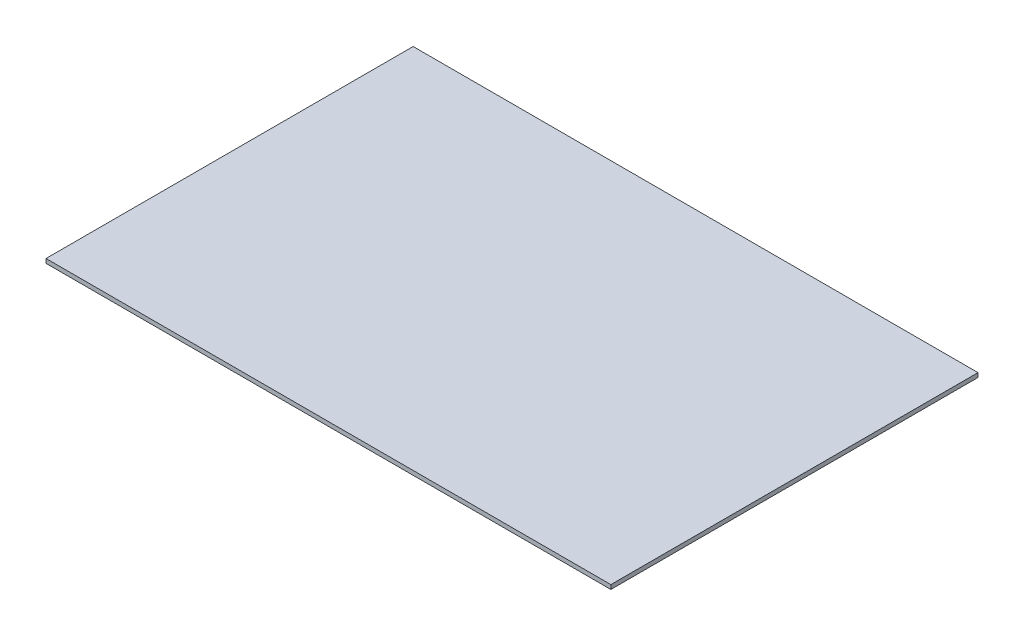
ISO-10303-21;
HEADER;
FILE_DESCRIPTION(('STEP AP214'),'2;1');
FILE_NAME('part.step','',(''),(''),'','','');
FILE_SCHEMA(('AUTOMOTIVE_DESIGN { 1 0 10303 214 1 1 1 1 }'));
ENDSEC;
DATA;
#1=APPLICATION_CONTEXT('core data for automotive mechanical design processes');
#2=APPLICATION_PROTOCOL_DEFINITION('international standard','automotive_design',2000,#1);
#3=PRODUCT_CONTEXT('',#1,'mechanical');
#4=PRODUCT('Part','Part','',(#3));
#5=PRODUCT_RELATED_PRODUCT_CATEGORY('part','',(#4));
#6=PRODUCT_DEFINITION_FORMATION('','',#4);
#7=PRODUCT_DEFINITION_CONTEXT('part definition',#1,'design');
#8=PRODUCT_DEFINITION('design','',#6,#7);
#9=PRODUCT_DEFINITION_SHAPE('','',#8);
#10=(LENGTH_UNIT() NAMED_UNIT(*) SI_UNIT(.MILLI.,.METRE.));
#11=(NAMED_UNIT(*) PLANE_ANGLE_UNIT() SI_UNIT($,.RADIAN.));
#12=(NAMED_UNIT(*) SI_UNIT($,.STERADIAN.) SOLID_ANGLE_UNIT());
#13=UNCERTAINTY_MEASURE_WITH_UNIT(LENGTH_MEASURE(1.E-05),#10,'distance_accuracy_value','');
#14=(GEOMETRIC_REPRESENTATION_CONTEXT(3) GLOBAL_UNCERTAINTY_ASSIGNED_CONTEXT((#13)) GLOBAL_UNIT_ASSIGNED_CONTEXT((#10,
#11,#12)) REPRESENTATION_CONTEXT('',''));
#15=CARTESIAN_POINT('',(0.,0.,0.));
#16=DIRECTION('',(0.,0.,1.));
#17=DIRECTION('',(1.,0.,0.));
#18=AXIS2_PLACEMENT_3D('',#15,#16,#17);
#19=CARTESIAN_POINT('',(0.,1.5,-130.));
#20=DIRECTION('',(1.,0.,0.));
#21=DIRECTION('',(0.,0.,-1.));
#22=AXIS2_PLACEMENT_3D('',#19,#20,#21);
#23=PLANE('',#22);
#24=DIRECTION('',(0.,0.,1.));
#25=VECTOR('',#24,1.);
#26=CARTESIAN_POINT('',(0.,0.,-130.));
#27=LINE('',#26,#25);
#28=CARTESIAN_POINT('',(0.,0.,-130.));
#29=VERTEX_POINT('',#28);
#30=CARTESIAN_POINT('',(0.,0.,0.));
#31=VERTEX_POINT('',#30);
#32=EDGE_CURVE('E104',#29,#31,#27,.T.);
#33=ORIENTED_EDGE('',*,*,#32,.T.);
#34=DIRECTION('',(0.,-1.,0.));
#35=VECTOR('',#34,1.);
#36=CARTESIAN_POINT('',(0.,1.5,0.));
#37=LINE('',#36,#35);
#38=CARTESIAN_POINT('',(0.,1.5,0.));
#39=VERTEX_POINT('',#38);
#40=EDGE_CURVE('E11',#39,#31,#37,.T.);
#41=ORIENTED_EDGE('',*,*,#40,.F.);
#42=DIRECTION('',(0.,0.,1.));
#43=VECTOR('',#42,1.);
#44=CARTESIAN_POINT('',(0.,1.5,-130.));
#45=LINE('',#44,#43);
#46=CARTESIAN_POINT('',(0.,1.5,-130.));
#47=VERTEX_POINT('',#46);
#48=EDGE_CURVE('E92',#47,#39,#45,.T.);
#49=ORIENTED_EDGE('',*,*,#48,.F.);
#50=DIRECTION('',(0.,-1.,0.));
#51=VECTOR('',#50,1.);
#52=CARTESIAN_POINT('',(0.,1.5,-130.));
#53=LINE('',#52,#51);
#54=EDGE_CURVE('E100',#47,#29,#53,.T.);
#55=ORIENTED_EDGE('',*,*,#54,.T.);
#56=EDGE_LOOP('',(#33,#41,#49,#55));
#57=FACE_BOUND('',#56,.T.);
#58=ADVANCED_FACE('F41',(#57),#23,.F.);
#59=CARTESIAN_POINT('',(0.,1.5,0.));
#60=DIRECTION('',(0.,0.,-1.));
#61=DIRECTION('',(-1.,0.,0.));
#62=AXIS2_PLACEMENT_3D('',#59,#60,#61);
#63=PLANE('',#62);
#64=DIRECTION('',(1.,0.,0.));
#65=VECTOR('',#64,1.);
#66=CARTESIAN_POINT('',(0.,0.,0.));
#67=LINE('',#66,#65);
#68=CARTESIAN_POINT('',(200.,0.,0.));
#69=VERTEX_POINT('',#68);
#70=EDGE_CURVE('E96',#31,#69,#67,.T.);
#71=ORIENTED_EDGE('',*,*,#70,.T.);
#72=DIRECTION('',(0.,-1.,0.));
#73=VECTOR('',#72,1.);
#74=CARTESIAN_POINT('',(200.,1.5,0.));
#75=LINE('',#74,#73);
#76=CARTESIAN_POINT('',(200.,1.5,0.));
#77=VERTEX_POINT('',#76);
#78=EDGE_CURVE('E49',#77,#69,#75,.T.);
#79=ORIENTED_EDGE('',*,*,#78,.F.);
#80=DIRECTION('',(1.,0.,0.));
#81=VECTOR('',#80,1.);
#82=CARTESIAN_POINT('',(0.,1.5,0.));
#83=LINE('',#82,#81);
#84=EDGE_CURVE('E87',#39,#77,#83,.T.);
#85=ORIENTED_EDGE('',*,*,#84,.F.);
#86=ORIENTED_EDGE('',*,*,#40,.T.);
#87=EDGE_LOOP('',(#71,#79,#85,#86));
#88=FACE_BOUND('',#87,.T.);
#89=ADVANCED_FACE('F95',(#88),#63,.F.);
#90=CARTESIAN_POINT('',(200.,1.5,-130.));
#91=DIRECTION('',(-1.,0.,0.));
#92=DIRECTION('',(0.,0.,1.));
#93=AXIS2_PLACEMENT_3D('',#90,#91,#92);
#94=PLANE('',#93);
#95=DIRECTION('',(0.,0.,-1.));
#96=VECTOR('',#95,1.);
#97=CARTESIAN_POINT('',(200.,0.,-130.));
#98=LINE('',#97,#96);
#99=CARTESIAN_POINT('',(200.,0.,-130.));
#100=VERTEX_POINT('',#99);
#101=EDGE_CURVE('E74',#69,#100,#98,.T.);
#102=ORIENTED_EDGE('',*,*,#101,.T.);
#103=DIRECTION('',(0.,-1.,0.));
#104=VECTOR('',#103,1.);
#105=CARTESIAN_POINT('',(200.,1.5,-130.));
#106=LINE('',#105,#104);
#107=CARTESIAN_POINT('',(200.,1.5,-130.));
#108=VERTEX_POINT('',#107);
#109=EDGE_CURVE('E97',#108,#100,#106,.T.);
#110=ORIENTED_EDGE('',*,*,#109,.F.);
#111=DIRECTION('',(0.,0.,-1.));
#112=VECTOR('',#111,1.);
#113=CARTESIAN_POINT('',(200.,1.5,-130.));
#114=LINE('',#113,#112);
#115=EDGE_CURVE('E90',#77,#108,#114,.T.);
#116=ORIENTED_EDGE('',*,*,#115,.F.);
#117=ORIENTED_EDGE('',*,*,#78,.T.);
#118=EDGE_LOOP('',(#102,#110,#116,#117));
#119=FACE_BOUND('',#118,.T.);
#120=ADVANCED_FACE('F98',(#119),#94,.F.);
#121=CARTESIAN_POINT('',(0.,1.5,-130.));
#122=DIRECTION('',(0.,0.,1.));
#123=DIRECTION('',(1.,0.,0.));
#124=AXIS2_PLACEMENT_3D('',#121,#122,#123);
#125=PLANE('',#124);
#126=DIRECTION('',(-1.,0.,0.));
#127=VECTOR('',#126,1.);
#128=CARTESIAN_POINT('',(0.,0.,-130.));
#129=LINE('',#128,#127);
#130=EDGE_CURVE('E80',#100,#29,#129,.T.);
#131=ORIENTED_EDGE('',*,*,#130,.T.);
#132=ORIENTED_EDGE('',*,*,#54,.F.);
#133=DIRECTION('',(-1.,0.,0.));
#134=VECTOR('',#133,1.);
#135=CARTESIAN_POINT('',(0.,1.5,-130.));
#136=LINE('',#135,#134);
#137=EDGE_CURVE('E57',#108,#47,#136,.T.);
#138=ORIENTED_EDGE('',*,*,#137,.F.);
#139=ORIENTED_EDGE('',*,*,#109,.T.);
#140=EDGE_LOOP('',(#131,#132,#138,#139));
#141=FACE_BOUND('',#140,.T.);
#142=ADVANCED_FACE('F111',(#141),#125,.F.);
#143=CARTESIAN_POINT('',(0.,1.5,0.));
#144=DIRECTION('',(0.,1.,0.));
#145=DIRECTION('',(0.,0.,1.));
#146=AXIS2_PLACEMENT_3D('',#143,#144,#145);
#147=PLANE('',#146);
#148=ORIENTED_EDGE('',*,*,#48,.T.);
#149=ORIENTED_EDGE('',*,*,#84,.T.);
#150=ORIENTED_EDGE('',*,*,#115,.T.);
#151=ORIENTED_EDGE('',*,*,#137,.T.);
#152=EDGE_LOOP('',(#148,#149,#150,#151));
#153=FACE_BOUND('',#152,.T.);
#154=ADVANCED_FACE('F88',(#153),#147,.T.);
#155=CARTESIAN_POINT('',(0.,0.,0.));
#156=DIRECTION('',(0.,1.,0.));
#157=DIRECTION('',(0.,0.,1.));
#158=AXIS2_PLACEMENT_3D('',#155,#156,#157);
#159=PLANE('',#158);
#160=ORIENTED_EDGE('',*,*,#32,.F.);
#161=ORIENTED_EDGE('',*,*,#130,.F.);
#162=ORIENTED_EDGE('',*,*,#101,.F.);
#163=ORIENTED_EDGE('',*,*,#70,.F.);
#164=EDGE_LOOP('',(#160,#161,#162,#163));
#165=FACE_BOUND('',#164,.T.);
#166=ADVANCED_FACE('F114',(#165),#159,.F.);
#167=CLOSED_SHELL('',(#58,#89,#120,#142,#154,#166));
#168=MANIFOLD_SOLID_BREP('B2',#167);
#169=ADVANCED_BREP_SHAPE_REPRESENTATION('',(#18,#168),#14);
#170=SHAPE_DEFINITION_REPRESENTATION(#9,#169);
ENDSEC;
END-ISO-10303-21;
